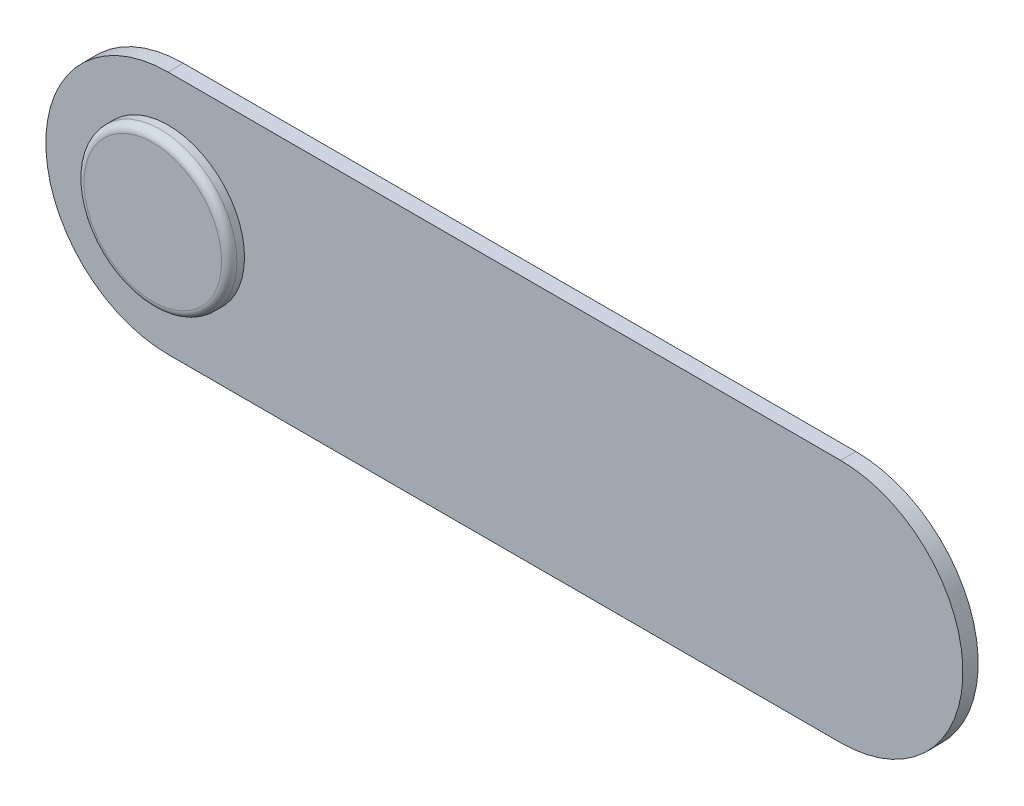
ISO-10303-21;
HEADER;
FILE_DESCRIPTION(('STEP AP214'),'2;1');
FILE_NAME('part.step','',(''),(''),'','','');
FILE_SCHEMA(('AUTOMOTIVE_DESIGN { 1 0 10303 214 1 1 1 1 }'));
ENDSEC;
DATA;
#1=APPLICATION_CONTEXT('core data for automotive mechanical design processes');
#2=APPLICATION_PROTOCOL_DEFINITION('international standard','automotive_design',2000,#1);
#3=PRODUCT_CONTEXT('',#1,'mechanical');
#4=PRODUCT('Part','Part','',(#3));
#5=PRODUCT_RELATED_PRODUCT_CATEGORY('part','',(#4));
#6=PRODUCT_DEFINITION_FORMATION('','',#4);
#7=PRODUCT_DEFINITION_CONTEXT('part definition',#1,'design');
#8=PRODUCT_DEFINITION('design','',#6,#7);
#9=PRODUCT_DEFINITION_SHAPE('','',#8);
#10=(LENGTH_UNIT() NAMED_UNIT(*) SI_UNIT(.MILLI.,.METRE.));
#11=(NAMED_UNIT(*) PLANE_ANGLE_UNIT() SI_UNIT($,.RADIAN.));
#12=(NAMED_UNIT(*) SI_UNIT($,.STERADIAN.) SOLID_ANGLE_UNIT());
#13=UNCERTAINTY_MEASURE_WITH_UNIT(LENGTH_MEASURE(1.E-05),#10,'distance_accuracy_value','');
#14=(GEOMETRIC_REPRESENTATION_CONTEXT(3) GLOBAL_UNCERTAINTY_ASSIGNED_CONTEXT((#13)) GLOBAL_UNIT_ASSIGNED_CONTEXT((#10,
#11,#12)) REPRESENTATION_CONTEXT('',''));
#15=CARTESIAN_POINT('',(0.,0.,0.));
#16=DIRECTION('',(0.,0.,1.));
#17=DIRECTION('',(1.,0.,0.));
#18=AXIS2_PLACEMENT_3D('',#15,#16,#17);
#19=CARTESIAN_POINT('',(0.,0.,0.5));
#20=DIRECTION('',(0.,0.,1.));
#21=DIRECTION('',(1.,0.,0.));
#22=AXIS2_PLACEMENT_3D('',#19,#20,#21);
#23=PLANE('',#22);
#24=CARTESIAN_POINT('',(0.,0.,0.5));
#25=DIRECTION('',(0.,0.,1.));
#26=DIRECTION('',(1.,0.,0.));
#27=AXIS2_PLACEMENT_3D('',#24,#25,#26);
#28=CIRCLE('',#27,4.);
#29=CARTESIAN_POINT('',(0.,4.,0.5));
#30=VERTEX_POINT('',#29);
#31=CARTESIAN_POINT('',(0.,-4.,0.5));
#32=VERTEX_POINT('',#31);
#33=EDGE_CURVE('E88',#30,#32,#28,.T.);
#34=ORIENTED_EDGE('',*,*,#33,.T.);
#35=DIRECTION('',(1.,0.,0.));
#36=VECTOR('',#35,1.);
#37=CARTESIAN_POINT('',(0.,-4.,0.5));
#38=LINE('',#37,#36);
#39=CARTESIAN_POINT('',(22.,-4.,0.5));
#40=VERTEX_POINT('',#39);
#41=EDGE_CURVE('E83',#32,#40,#38,.T.);
#42=ORIENTED_EDGE('',*,*,#41,.T.);
#43=CARTESIAN_POINT('',(22.,0.,0.5));
#44=DIRECTION('',(0.,0.,1.));
#45=DIRECTION('',(1.,0.,0.));
#46=AXIS2_PLACEMENT_3D('',#43,#44,#45);
#47=CIRCLE('',#46,4.);
#48=CARTESIAN_POINT('',(22.,4.,0.5));
#49=VERTEX_POINT('',#48);
#50=EDGE_CURVE('E86',#40,#49,#47,.T.);
#51=ORIENTED_EDGE('',*,*,#50,.T.);
#52=DIRECTION('',(-1.,0.,0.));
#53=VECTOR('',#52,1.);
#54=CARTESIAN_POINT('',(0.,4.,0.5));
#55=LINE('',#54,#53);
#56=EDGE_CURVE('E52',#49,#30,#55,.T.);
#57=ORIENTED_EDGE('',*,*,#56,.T.);
#58=EDGE_LOOP('',(#34,#42,#51,#57));
#59=FACE_BOUND('',#58,.T.);
#60=CARTESIAN_POINT('',(0.,0.,0.5));
#61=DIRECTION('',(0.,0.,1.));
#62=DIRECTION('',(1.,0.,0.));
#63=AXIS2_PLACEMENT_3D('',#60,#61,#62);
#64=CIRCLE('',#63,2.5);
#65=CARTESIAN_POINT('',(2.5,0.,0.5));
#66=VERTEX_POINT('',#65);
#67=EDGE_CURVE('E106',#66,#66,#64,.T.);
#68=ORIENTED_EDGE('',*,*,#67,.F.);
#69=EDGE_LOOP('',(#68));
#70=FACE_BOUND('',#69,.T.);
#71=ADVANCED_FACE('F35',(#59,#70),#23,.T.);
#72=CARTESIAN_POINT('',(0.,0.,0.5));
#73=DIRECTION('',(0.,0.,-1.));
#74=DIRECTION('',(-1.,0.,0.));
#75=AXIS2_PLACEMENT_3D('',#72,#73,#74);
#76=CYLINDRICAL_SURFACE('',#75,4.);
#77=CARTESIAN_POINT('',(0.,0.,0.));
#78=DIRECTION('',(0.,0.,1.));
#79=DIRECTION('',(1.,0.,0.));
#80=AXIS2_PLACEMENT_3D('',#77,#78,#79);
#81=CIRCLE('',#80,4.);
#82=CARTESIAN_POINT('',(0.,4.,0.));
#83=VERTEX_POINT('',#82);
#84=CARTESIAN_POINT('',(0.,-4.,0.));
#85=VERTEX_POINT('',#84);
#86=EDGE_CURVE('E103',#83,#85,#81,.T.);
#87=ORIENTED_EDGE('',*,*,#86,.T.);
#88=DIRECTION('',(0.,0.,-1.));
#89=VECTOR('',#88,1.);
#90=CARTESIAN_POINT('',(0.,-4.,0.5));
#91=LINE('',#90,#89);
#92=EDGE_CURVE('E94',#32,#85,#91,.T.);
#93=ORIENTED_EDGE('',*,*,#92,.F.);
#94=ORIENTED_EDGE('',*,*,#33,.F.);
#95=DIRECTION('',(0.,0.,-1.));
#96=VECTOR('',#95,1.);
#97=CARTESIAN_POINT('',(0.,4.,0.5));
#98=LINE('',#97,#96);
#99=EDGE_CURVE('E99',#30,#83,#98,.T.);
#100=ORIENTED_EDGE('',*,*,#99,.T.);
#101=EDGE_LOOP('',(#87,#93,#94,#100));
#102=FACE_BOUND('',#101,.T.);
#103=ADVANCED_FACE('F126',(#102),#76,.T.);
#104=CARTESIAN_POINT('',(0.,-4.,0.5));
#105=DIRECTION('',(0.,1.,0.));
#106=DIRECTION('',(0.,0.,1.));
#107=AXIS2_PLACEMENT_3D('',#104,#105,#106);
#108=PLANE('',#107);
#109=DIRECTION('',(1.,0.,0.));
#110=VECTOR('',#109,1.);
#111=CARTESIAN_POINT('',(0.,-4.,0.));
#112=LINE('',#111,#110);
#113=CARTESIAN_POINT('',(22.,-4.,0.));
#114=VERTEX_POINT('',#113);
#115=EDGE_CURVE('E93',#85,#114,#112,.T.);
#116=ORIENTED_EDGE('',*,*,#115,.T.);
#117=DIRECTION('',(0.,0.,-1.));
#118=VECTOR('',#117,1.);
#119=CARTESIAN_POINT('',(22.,-4.,0.5));
#120=LINE('',#119,#118);
#121=EDGE_CURVE('E91',#40,#114,#120,.T.);
#122=ORIENTED_EDGE('',*,*,#121,.F.);
#123=ORIENTED_EDGE('',*,*,#41,.F.);
#124=ORIENTED_EDGE('',*,*,#92,.T.);
#125=EDGE_LOOP('',(#116,#122,#123,#124));
#126=FACE_BOUND('',#125,.T.);
#127=ADVANCED_FACE('F92',(#126),#108,.F.);
#128=CARTESIAN_POINT('',(22.,0.,0.5));
#129=DIRECTION('',(0.,0.,-1.));
#130=DIRECTION('',(-1.,0.,0.));
#131=AXIS2_PLACEMENT_3D('',#128,#129,#130);
#132=CYLINDRICAL_SURFACE('',#131,4.);
#133=CARTESIAN_POINT('',(22.,0.,0.));
#134=DIRECTION('',(0.,0.,1.));
#135=DIRECTION('',(1.,0.,0.));
#136=AXIS2_PLACEMENT_3D('',#133,#134,#135);
#137=CIRCLE('',#136,4.);
#138=CARTESIAN_POINT('',(22.,4.,0.));
#139=VERTEX_POINT('',#138);
#140=EDGE_CURVE('E69',#114,#139,#137,.T.);
#141=ORIENTED_EDGE('',*,*,#140,.T.);
#142=DIRECTION('',(0.,0.,-1.));
#143=VECTOR('',#142,1.);
#144=CARTESIAN_POINT('',(22.,4.,0.5));
#145=LINE('',#144,#143);
#146=EDGE_CURVE('E95',#49,#139,#145,.T.);
#147=ORIENTED_EDGE('',*,*,#146,.F.);
#148=ORIENTED_EDGE('',*,*,#50,.F.);
#149=ORIENTED_EDGE('',*,*,#121,.T.);
#150=EDGE_LOOP('',(#141,#147,#148,#149));
#151=FACE_BOUND('',#150,.T.);
#152=ADVANCED_FACE('F97',(#151),#132,.T.);
#153=CARTESIAN_POINT('',(0.,4.,0.5));
#154=DIRECTION('',(0.,-1.,0.));
#155=DIRECTION('',(0.,0.,-1.));
#156=AXIS2_PLACEMENT_3D('',#153,#154,#155);
#157=PLANE('',#156);
#158=DIRECTION('',(-1.,0.,0.));
#159=VECTOR('',#158,1.);
#160=CARTESIAN_POINT('',(0.,4.,0.));
#161=LINE('',#160,#159);
#162=EDGE_CURVE('E75',#139,#83,#161,.T.);
#163=ORIENTED_EDGE('',*,*,#162,.T.);
#164=ORIENTED_EDGE('',*,*,#99,.F.);
#165=ORIENTED_EDGE('',*,*,#56,.F.);
#166=ORIENTED_EDGE('',*,*,#146,.T.);
#167=EDGE_LOOP('',(#163,#164,#165,#166));
#168=FACE_BOUND('',#167,.T.);
#169=ADVANCED_FACE('F137',(#168),#157,.F.);
#170=CARTESIAN_POINT('',(0.,0.,0.));
#171=DIRECTION('',(0.,0.,1.));
#172=DIRECTION('',(1.,0.,0.));
#173=AXIS2_PLACEMENT_3D('',#170,#171,#172);
#174=PLANE('',#173);
#175=ORIENTED_EDGE('',*,*,#86,.F.);
#176=ORIENTED_EDGE('',*,*,#162,.F.);
#177=ORIENTED_EDGE('',*,*,#140,.F.);
#178=ORIENTED_EDGE('',*,*,#115,.F.);
#179=EDGE_LOOP('',(#175,#176,#177,#178));
#180=FACE_BOUND('',#179,.T.);
#181=ADVANCED_FACE('F134',(#180),#174,.F.);
#182=CARTESIAN_POINT('',(0.,0.,1.));
#183=DIRECTION('',(0.,0.,-1.));
#184=DIRECTION('',(-1.,0.,0.));
#185=AXIS2_PLACEMENT_3D('',#182,#183,#184);
#186=CYLINDRICAL_SURFACE('',#185,2.5);
#187=CARTESIAN_POINT('',(0.,0.,0.75));
#188=DIRECTION('',(0.,0.,1.));
#189=DIRECTION('',(1.,0.,0.));
#190=AXIS2_PLACEMENT_3D('',#187,#188,#189);
#191=CIRCLE('',#190,2.5);
#192=CARTESIAN_POINT('',(2.5,0.,0.75));
#193=VERTEX_POINT('',#192);
#194=EDGE_CURVE('E11',#193,#193,#191,.F.);
#195=ORIENTED_EDGE('',*,*,#194,.T.);
#196=EDGE_LOOP('',(#195));
#197=FACE_BOUND('',#196,.T.);
#198=ORIENTED_EDGE('',*,*,#67,.T.);
#199=EDGE_LOOP('',(#198));
#200=FACE_BOUND('',#199,.T.);
#201=ADVANCED_FACE('F122',(#197,#200),#186,.T.);
#202=CARTESIAN_POINT('',(0.,0.,1.));
#203=DIRECTION('',(0.,0.,1.));
#204=DIRECTION('',(1.,0.,0.));
#205=AXIS2_PLACEMENT_3D('',#202,#203,#204);
#206=PLANE('',#205);
#207=CARTESIAN_POINT('',(0.,0.,1.));
#208=DIRECTION('',(0.,0.,1.));
#209=DIRECTION('',(1.,0.,0.));
#210=AXIS2_PLACEMENT_3D('',#207,#208,#209);
#211=CIRCLE('',#210,2.25);
#212=CARTESIAN_POINT('',(2.25,0.,1.));
#213=VERTEX_POINT('',#212);
#214=EDGE_CURVE('E44',#213,#213,#211,.T.);
#215=ORIENTED_EDGE('',*,*,#214,.T.);
#216=EDGE_LOOP('',(#215));
#217=FACE_BOUND('',#216,.T.);
#218=ADVANCED_FACE('F115',(#217),#206,.T.);
#219=CARTESIAN_POINT('',(0.,0.,0.75));
#220=DIRECTION('',(0.,0.,1.));
#221=DIRECTION('',(1.,0.,0.));
#222=AXIS2_PLACEMENT_3D('',#219,#220,#221);
#223=TOROIDAL_SURFACE('',#222,2.25,0.25);
#224=ORIENTED_EDGE('',*,*,#194,.F.);
#225=EDGE_LOOP('',(#224));
#226=FACE_BOUND('',#225,.T.);
#227=ORIENTED_EDGE('',*,*,#214,.F.);
#228=EDGE_LOOP('',(#227));
#229=FACE_BOUND('',#228,.T.);
#230=ADVANCED_FACE('F37',(#226,#229),#223,.T.);
#231=CLOSED_SHELL('',(#71,#103,#127,#152,#169,#181,#201,#218,#230));
#232=MANIFOLD_SOLID_BREP('B2',#231);
#233=ADVANCED_BREP_SHAPE_REPRESENTATION('',(#18,#232),#14);
#234=SHAPE_DEFINITION_REPRESENTATION(#9,#233);
ENDSEC;
END-ISO-10303-21;
